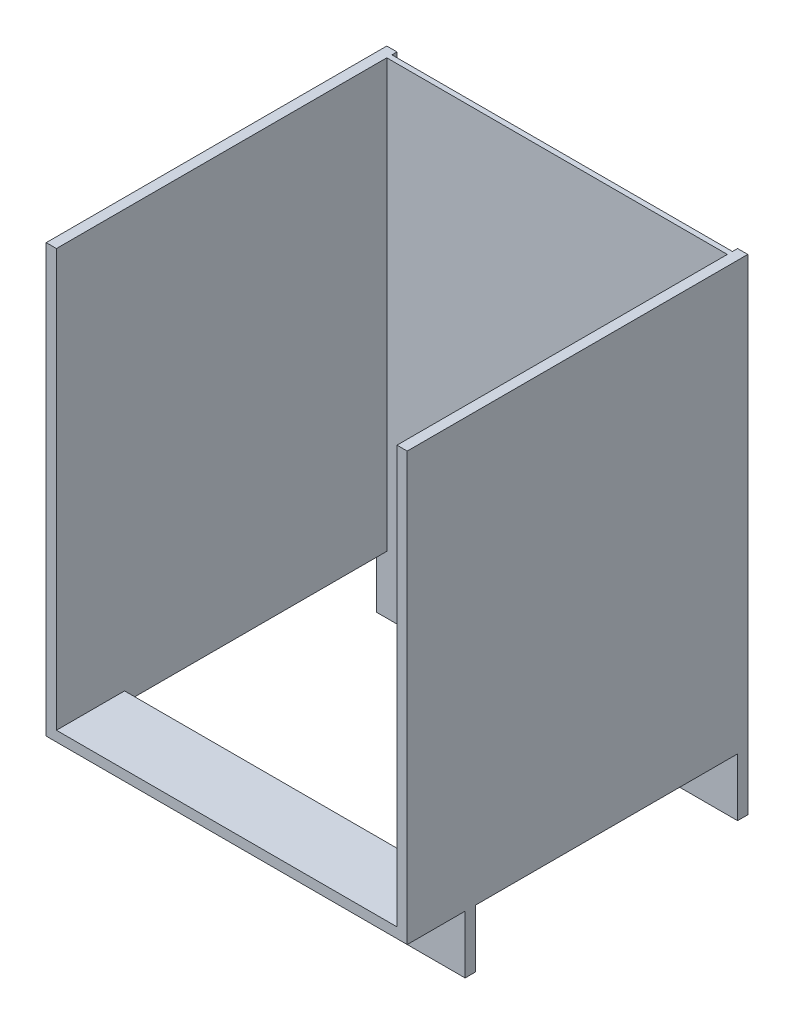
ISO-10303-21;
HEADER;
FILE_DESCRIPTION(('STEP AP214'),'2;1');
FILE_NAME('part.step','',(''),(''),'','','');
FILE_SCHEMA(('AUTOMOTIVE_DESIGN { 1 0 10303 214 1 1 1 1 }'));
ENDSEC;
DATA;
#1=APPLICATION_CONTEXT('core data for automotive mechanical design processes');
#2=APPLICATION_PROTOCOL_DEFINITION('international standard','automotive_design',2000,#1);
#3=PRODUCT_CONTEXT('',#1,'mechanical');
#4=PRODUCT('Part','Part','',(#3));
#5=PRODUCT_RELATED_PRODUCT_CATEGORY('part','',(#4));
#6=PRODUCT_DEFINITION_FORMATION('','',#4);
#7=PRODUCT_DEFINITION_CONTEXT('part definition',#1,'design');
#8=PRODUCT_DEFINITION('design','',#6,#7);
#9=PRODUCT_DEFINITION_SHAPE('','',#8);
#10=(LENGTH_UNIT() NAMED_UNIT(*) SI_UNIT(.MILLI.,.METRE.));
#11=(NAMED_UNIT(*) PLANE_ANGLE_UNIT() SI_UNIT($,.RADIAN.));
#12=(NAMED_UNIT(*) SI_UNIT($,.STERADIAN.) SOLID_ANGLE_UNIT());
#13=UNCERTAINTY_MEASURE_WITH_UNIT(LENGTH_MEASURE(1.E-05),#10,'distance_accuracy_value','');
#14=(GEOMETRIC_REPRESENTATION_CONTEXT(3) GLOBAL_UNCERTAINTY_ASSIGNED_CONTEXT((#13)) GLOBAL_UNIT_ASSIGNED_CONTEXT((#10,
#11,#12)) REPRESENTATION_CONTEXT('',''));
#15=CARTESIAN_POINT('',(0.,0.,0.));
#16=DIRECTION('',(0.,0.,1.));
#17=DIRECTION('',(1.,0.,0.));
#18=AXIS2_PLACEMENT_3D('',#15,#16,#17);
#19=CARTESIAN_POINT('',(0.,0.,600.));
#20=DIRECTION('',(0.,1.,0.));
#21=DIRECTION('',(0.,0.,1.));
#22=AXIS2_PLACEMENT_3D('',#19,#20,#21);
#23=PLANE('',#22);
#24=DIRECTION('',(1.,0.,0.));
#25=VECTOR('',#24,1.);
#26=CARTESIAN_POINT('',(636.,0.,18.));
#27=LINE('',#26,#25);
#28=CARTESIAN_POINT('',(0.,0.,18.));
#29=VERTEX_POINT('',#28);
#30=CARTESIAN_POINT('',(18.0000000000002,0.,18.));
#31=VERTEX_POINT('',#30);
#32=EDGE_CURVE('E207',#29,#31,#27,.T.);
#33=ORIENTED_EDGE('',*,*,#32,.T.);
#34=DIRECTION('',(0.,0.,-1.));
#35=VECTOR('',#34,1.);
#36=CARTESIAN_POINT('',(18.,0.,480.));
#37=LINE('',#36,#35);
#38=CARTESIAN_POINT('',(18.,0.,480.));
#39=VERTEX_POINT('',#38);
#40=EDGE_CURVE('E200',#39,#31,#37,.T.);
#41=ORIENTED_EDGE('',*,*,#40,.F.);
#42=DIRECTION('',(-1.,0.,0.));
#43=VECTOR('',#42,1.);
#44=CARTESIAN_POINT('',(0.,0.,480.));
#45=LINE('',#44,#43);
#46=CARTESIAN_POINT('',(0.,0.,480.));
#47=VERTEX_POINT('',#46);
#48=EDGE_CURVE('E234',#39,#47,#45,.T.);
#49=ORIENTED_EDGE('',*,*,#48,.T.);
#50=DIRECTION('',(0.,0.,-1.));
#51=VECTOR('',#50,1.);
#52=CARTESIAN_POINT('',(0.,0.,600.));
#53=LINE('',#52,#51);
#54=EDGE_CURVE('E51',#47,#29,#53,.T.);
#55=ORIENTED_EDGE('',*,*,#54,.T.);
#56=EDGE_LOOP('',(#33,#41,#49,#55));
#57=FACE_BOUND('',#56,.T.);
#58=ADVANCED_FACE('F43',(#57),#23,.F.);
#59=CARTESIAN_POINT('',(636.,0.,480.));
#60=VERTEX_POINT('',#59);
#61=CARTESIAN_POINT('',(618.,0.,480.));
#62=VERTEX_POINT('',#61);
#63=EDGE_CURVE('E198',#60,#62,#45,.T.);
#64=ORIENTED_EDGE('',*,*,#63,.T.);
#65=DIRECTION('',(0.,0.,1.));
#66=VECTOR('',#65,1.);
#67=CARTESIAN_POINT('',(618.,0.,480.));
#68=LINE('',#67,#66);
#69=CARTESIAN_POINT('',(618.,0.,18.));
#70=VERTEX_POINT('',#69);
#71=EDGE_CURVE('E184',#70,#62,#68,.T.);
#72=ORIENTED_EDGE('',*,*,#71,.F.);
#73=CARTESIAN_POINT('',(636.,0.,18.));
#74=VERTEX_POINT('',#73);
#75=EDGE_CURVE('E195',#70,#74,#27,.T.);
#76=ORIENTED_EDGE('',*,*,#75,.T.);
#77=DIRECTION('',(0.,0.,-1.));
#78=VECTOR('',#77,1.);
#79=CARTESIAN_POINT('',(636.,0.,600.));
#80=LINE('',#79,#78);
#81=EDGE_CURVE('E318',#60,#74,#80,.T.);
#82=ORIENTED_EDGE('',*,*,#81,.F.);
#83=EDGE_LOOP('',(#64,#72,#76,#82));
#84=FACE_BOUND('',#83,.T.);
#85=ADVANCED_FACE('F193',(#84),#23,.F.);
#86=DIRECTION('',(-1.,0.,0.));
#87=VECTOR('',#86,1.);
#88=CARTESIAN_POINT('',(0.,0.,498.));
#89=LINE('',#88,#87);
#90=CARTESIAN_POINT('',(636.,0.,498.));
#91=VERTEX_POINT('',#90);
#92=CARTESIAN_POINT('',(0.,0.,498.));
#93=VERTEX_POINT('',#92);
#94=EDGE_CURVE('E229',#91,#93,#89,.T.);
#95=ORIENTED_EDGE('',*,*,#94,.F.);
#96=CARTESIAN_POINT('',(636.,0.,600.));
#97=VERTEX_POINT('',#96);
#98=EDGE_CURVE('E319',#97,#91,#80,.T.);
#99=ORIENTED_EDGE('',*,*,#98,.F.);
#100=DIRECTION('',(1.,0.,0.));
#101=VECTOR('',#100,1.);
#102=CARTESIAN_POINT('',(0.,0.,600.));
#103=LINE('',#102,#101);
#104=CARTESIAN_POINT('',(0.,0.,600.));
#105=VERTEX_POINT('',#104);
#106=EDGE_CURVE('E298',#105,#97,#103,.T.);
#107=ORIENTED_EDGE('',*,*,#106,.F.);
#108=EDGE_CURVE('E11',#105,#93,#53,.T.);
#109=ORIENTED_EDGE('',*,*,#108,.T.);
#110=EDGE_LOOP('',(#95,#99,#107,#109));
#111=FACE_BOUND('',#110,.T.);
#112=ADVANCED_FACE('F363',(#111),#23,.F.);
#113=CARTESIAN_POINT('',(18.0000000000001,18.,-948.801876052108));
#114=DIRECTION('',(0.,-1.,0.));
#115=DIRECTION('',(0.,0.,-1.));
#116=AXIS2_PLACEMENT_3D('',#113,#114,#115);
#117=PLANE('',#116);
#118=DIRECTION('',(0.,0.,1.));
#119=VECTOR('',#118,1.);
#120=CARTESIAN_POINT('',(618.,18.,-948.801876052108));
#121=LINE('',#120,#119);
#122=CARTESIAN_POINT('',(618.,18.,480.));
#123=VERTEX_POINT('',#122);
#124=CARTESIAN_POINT('',(618.,18.,600.));
#125=VERTEX_POINT('',#124);
#126=EDGE_CURVE('E274',#123,#125,#121,.T.);
#127=ORIENTED_EDGE('',*,*,#126,.F.);
#128=DIRECTION('',(1.,0.,0.));
#129=VECTOR('',#128,1.);
#130=CARTESIAN_POINT('',(18.,18.,480.));
#131=LINE('',#130,#129);
#132=CARTESIAN_POINT('',(18.,18.,480.));
#133=VERTEX_POINT('',#132);
#134=EDGE_CURVE('E333',#133,#123,#131,.T.);
#135=ORIENTED_EDGE('',*,*,#134,.F.);
#136=DIRECTION('',(0.,0.,1.));
#137=VECTOR('',#136,1.);
#138=CARTESIAN_POINT('',(18.0000000000001,18.,-948.801876052108));
#139=LINE('',#138,#137);
#140=CARTESIAN_POINT('',(18.0000000000001,18.,600.));
#141=VERTEX_POINT('',#140);
#142=EDGE_CURVE('E278',#133,#141,#139,.T.);
#143=ORIENTED_EDGE('',*,*,#142,.T.);
#144=DIRECTION('',(1.,0.,0.));
#145=VECTOR('',#144,1.);
#146=CARTESIAN_POINT('',(18.0000000000001,18.,600.));
#147=LINE('',#146,#145);
#148=EDGE_CURVE('E267',#141,#125,#147,.T.);
#149=ORIENTED_EDGE('',*,*,#148,.T.);
#150=EDGE_LOOP('',(#127,#135,#143,#149));
#151=FACE_BOUND('',#150,.T.);
#152=ADVANCED_FACE('F379',(#151),#117,.F.);
#153=CARTESIAN_POINT('',(618.,753.,-948.801876052108));
#154=DIRECTION('',(1.,0.,0.));
#155=DIRECTION('',(0.,1.,0.));
#156=AXIS2_PLACEMENT_3D('',#153,#154,#155);
#157=PLANE('',#156);
#158=DIRECTION('',(0.,-1.,0.));
#159=VECTOR('',#158,1.);
#160=CARTESIAN_POINT('',(618.,753.,18.));
#161=LINE('',#160,#159);
#162=CARTESIAN_POINT('',(618.,753.,18.));
#163=VERTEX_POINT('',#162);
#164=EDGE_CURVE('E181',#163,#70,#161,.T.);
#165=ORIENTED_EDGE('',*,*,#164,.T.);
#166=ORIENTED_EDGE('',*,*,#71,.T.);
#167=DIRECTION('',(0.,-1.,0.));
#168=VECTOR('',#167,1.);
#169=CARTESIAN_POINT('',(618.,753.001,480.));
#170=LINE('',#169,#168);
#171=EDGE_CURVE('E199',#123,#62,#170,.T.);
#172=ORIENTED_EDGE('',*,*,#171,.F.);
#173=ORIENTED_EDGE('',*,*,#126,.T.);
#174=DIRECTION('',(0.,1.,0.));
#175=VECTOR('',#174,1.);
#176=CARTESIAN_POINT('',(618.,753.,600.));
#177=LINE('',#176,#175);
#178=CARTESIAN_POINT('',(618.,753.,600.));
#179=VERTEX_POINT('',#178);
#180=EDGE_CURVE('E264',#125,#179,#177,.T.);
#181=ORIENTED_EDGE('',*,*,#180,.T.);
#182=DIRECTION('',(0.,0.,1.));
#183=VECTOR('',#182,1.);
#184=CARTESIAN_POINT('',(618.,753.,-948.801876052108));
#185=LINE('',#184,#183);
#186=EDGE_CURVE('E187',#163,#179,#185,.T.);
#187=ORIENTED_EDGE('',*,*,#186,.F.);
#188=EDGE_LOOP('',(#165,#166,#172,#173,#181,#187));
#189=FACE_BOUND('',#188,.T.);
#190=ADVANCED_FACE('F183',(#189),#157,.F.);
#191=CARTESIAN_POINT('',(18.,753.,-948.801876052108));
#192=DIRECTION('',(-1.,0.,0.));
#193=DIRECTION('',(0.,-1.,0.));
#194=AXIS2_PLACEMENT_3D('',#191,#192,#193);
#195=PLANE('',#194);
#196=DIRECTION('',(0.,1.,0.));
#197=VECTOR('',#196,1.);
#198=CARTESIAN_POINT('',(18.0000000000001,753.,18.));
#199=LINE('',#198,#197);
#200=CARTESIAN_POINT('',(18.,753.,18.));
#201=VERTEX_POINT('',#200);
#202=EDGE_CURVE('E58',#31,#201,#199,.T.);
#203=ORIENTED_EDGE('',*,*,#202,.T.);
#204=DIRECTION('',(0.,0.,1.));
#205=VECTOR('',#204,1.);
#206=CARTESIAN_POINT('',(18.,753.,-948.801876052108));
#207=LINE('',#206,#205);
#208=CARTESIAN_POINT('',(18.,753.,600.));
#209=VERTEX_POINT('',#208);
#210=EDGE_CURVE('E285',#201,#209,#207,.T.);
#211=ORIENTED_EDGE('',*,*,#210,.T.);
#212=DIRECTION('',(0.,-1.,0.));
#213=VECTOR('',#212,1.);
#214=CARTESIAN_POINT('',(18.,753.,600.));
#215=LINE('',#214,#213);
#216=EDGE_CURVE('E260',#209,#141,#215,.T.);
#217=ORIENTED_EDGE('',*,*,#216,.T.);
#218=ORIENTED_EDGE('',*,*,#142,.F.);
#219=DIRECTION('',(0.,-1.,0.));
#220=VECTOR('',#219,1.);
#221=CARTESIAN_POINT('',(18.,753.001,480.));
#222=LINE('',#221,#220);
#223=EDGE_CURVE('E218',#133,#39,#222,.T.);
#224=ORIENTED_EDGE('',*,*,#223,.T.);
#225=ORIENTED_EDGE('',*,*,#40,.T.);
#226=EDGE_LOOP('',(#203,#211,#217,#218,#224,#225));
#227=FACE_BOUND('',#226,.T.);
#228=ADVANCED_FACE('F374',(#227),#195,.F.);
#229=CARTESIAN_POINT('',(0.,0.,600.));
#230=DIRECTION('',(1.,0.,0.));
#231=DIRECTION('',(0.,0.,-1.));
#232=AXIS2_PLACEMENT_3D('',#229,#230,#231);
#233=PLANE('',#232);
#234=DIRECTION('',(0.,-1.,0.));
#235=VECTOR('',#234,1.);
#236=CARTESIAN_POINT('',(0.,0.,0.));
#237=LINE('',#236,#235);
#238=CARTESIAN_POINT('',(0.,753.,0.));
#239=VERTEX_POINT('',#238);
#240=CARTESIAN_POINT('',(0.,-102.,0.));
#241=VERTEX_POINT('',#240);
#242=EDGE_CURVE('E294',#239,#241,#237,.T.);
#243=ORIENTED_EDGE('',*,*,#242,.T.);
#244=DIRECTION('',(0.,0.,-1.));
#245=VECTOR('',#244,1.);
#246=CARTESIAN_POINT('',(0.,-102.,18.));
#247=LINE('',#246,#245);
#248=CARTESIAN_POINT('',(0.,-102.,18.));
#249=VERTEX_POINT('',#248);
#250=EDGE_CURVE('E219',#249,#241,#247,.T.);
#251=ORIENTED_EDGE('',*,*,#250,.F.);
#252=DIRECTION('',(0.,1.,0.));
#253=VECTOR('',#252,1.);
#254=CARTESIAN_POINT('',(0.,0.,18.));
#255=LINE('',#254,#253);
#256=EDGE_CURVE('E208',#249,#29,#255,.T.);
#257=ORIENTED_EDGE('',*,*,#256,.T.);
#258=ORIENTED_EDGE('',*,*,#54,.F.);
#259=DIRECTION('',(0.,-1.,0.));
#260=VECTOR('',#259,1.);
#261=CARTESIAN_POINT('',(0.,0.,480.));
#262=LINE('',#261,#260);
#263=CARTESIAN_POINT('',(0.,-102.,480.));
#264=VERTEX_POINT('',#263);
#265=EDGE_CURVE('E225',#47,#264,#262,.T.);
#266=ORIENTED_EDGE('',*,*,#265,.T.);
#267=DIRECTION('',(0.,0.,1.));
#268=VECTOR('',#267,1.);
#269=CARTESIAN_POINT('',(0.,-102.,480.));
#270=LINE('',#269,#268);
#271=CARTESIAN_POINT('',(0.,-102.,498.));
#272=VERTEX_POINT('',#271);
#273=EDGE_CURVE('E236',#264,#272,#270,.T.);
#274=ORIENTED_EDGE('',*,*,#273,.T.);
#275=DIRECTION('',(0.,-1.,0.));
#276=VECTOR('',#275,1.);
#277=CARTESIAN_POINT('',(0.,0.,498.));
#278=LINE('',#277,#276);
#279=EDGE_CURVE('E222',#93,#272,#278,.T.);
#280=ORIENTED_EDGE('',*,*,#279,.F.);
#281=ORIENTED_EDGE('',*,*,#108,.F.);
#282=DIRECTION('',(0.,-1.,0.));
#283=VECTOR('',#282,1.);
#284=CARTESIAN_POINT('',(0.,0.,600.));
#285=LINE('',#284,#283);
#286=CARTESIAN_POINT('',(0.,753.,600.));
#287=VERTEX_POINT('',#286);
#288=EDGE_CURVE('E295',#287,#105,#285,.T.);
#289=ORIENTED_EDGE('',*,*,#288,.F.);
#290=DIRECTION('',(0.,0.,-1.));
#291=VECTOR('',#290,1.);
#292=CARTESIAN_POINT('',(0.,753.,600.));
#293=LINE('',#292,#291);
#294=EDGE_CURVE('E307',#287,#239,#293,.T.);
#295=ORIENTED_EDGE('',*,*,#294,.T.);
#296=EDGE_LOOP('',(#243,#251,#257,#258,#266,#274,#280,#281,#289,#295));
#297=FACE_BOUND('',#296,.T.);
#298=ADVANCED_FACE('F45',(#297),#233,.F.);
#299=CARTESIAN_POINT('',(636.,0.,600.));
#300=DIRECTION('',(-1.,0.,0.));
#301=DIRECTION('',(0.,0.,1.));
#302=AXIS2_PLACEMENT_3D('',#299,#300,#301);
#303=PLANE('',#302);
#304=DIRECTION('',(0.,1.,0.));
#305=VECTOR('',#304,1.);
#306=CARTESIAN_POINT('',(636.,0.,0.));
#307=LINE('',#306,#305);
#308=CARTESIAN_POINT('',(636.,-102.,0.));
#309=VERTEX_POINT('',#308);
#310=CARTESIAN_POINT('',(636.,753.,0.));
#311=VERTEX_POINT('',#310);
#312=EDGE_CURVE('E309',#309,#311,#307,.T.);
#313=ORIENTED_EDGE('',*,*,#312,.T.);
#314=DIRECTION('',(0.,0.,-1.));
#315=VECTOR('',#314,1.);
#316=CARTESIAN_POINT('',(636.,753.,600.));
#317=LINE('',#316,#315);
#318=CARTESIAN_POINT('',(636.,753.,600.));
#319=VERTEX_POINT('',#318);
#320=EDGE_CURVE('E316',#319,#311,#317,.T.);
#321=ORIENTED_EDGE('',*,*,#320,.F.);
#322=DIRECTION('',(0.,1.,0.));
#323=VECTOR('',#322,1.);
#324=CARTESIAN_POINT('',(636.,0.,600.));
#325=LINE('',#324,#323);
#326=EDGE_CURVE('E301',#97,#319,#325,.T.);
#327=ORIENTED_EDGE('',*,*,#326,.F.);
#328=ORIENTED_EDGE('',*,*,#98,.T.);
#329=DIRECTION('',(0.,1.,0.));
#330=VECTOR('',#329,1.);
#331=CARTESIAN_POINT('',(636.,0.,498.));
#332=LINE('',#331,#330);
#333=CARTESIAN_POINT('',(636.,-102.,498.));
#334=VERTEX_POINT('',#333);
#335=EDGE_CURVE('E242',#334,#91,#332,.T.);
#336=ORIENTED_EDGE('',*,*,#335,.F.);
#337=DIRECTION('',(0.,0.,1.));
#338=VECTOR('',#337,1.);
#339=CARTESIAN_POINT('',(636.,-102.,480.));
#340=LINE('',#339,#338);
#341=CARTESIAN_POINT('',(636.,-102.,480.));
#342=VERTEX_POINT('',#341);
#343=EDGE_CURVE('E190',#342,#334,#340,.T.);
#344=ORIENTED_EDGE('',*,*,#343,.F.);
#345=DIRECTION('',(0.,1.,0.));
#346=VECTOR('',#345,1.);
#347=CARTESIAN_POINT('',(636.,0.,480.));
#348=LINE('',#347,#346);
#349=EDGE_CURVE('E232',#342,#60,#348,.T.);
#350=ORIENTED_EDGE('',*,*,#349,.T.);
#351=ORIENTED_EDGE('',*,*,#81,.T.);
#352=DIRECTION('',(0.,-1.,0.));
#353=VECTOR('',#352,1.);
#354=CARTESIAN_POINT('',(636.,0.,18.));
#355=LINE('',#354,#353);
#356=CARTESIAN_POINT('',(636.,-102.,18.));
#357=VERTEX_POINT('',#356);
#358=EDGE_CURVE('E206',#74,#357,#355,.T.);
#359=ORIENTED_EDGE('',*,*,#358,.T.);
#360=DIRECTION('',(0.,0.,-1.));
#361=VECTOR('',#360,1.);
#362=CARTESIAN_POINT('',(636.,-102.,18.));
#363=LINE('',#362,#361);
#364=EDGE_CURVE('E210',#357,#309,#363,.T.);
#365=ORIENTED_EDGE('',*,*,#364,.T.);
#366=EDGE_LOOP('',(#313,#321,#327,#328,#336,#344,#350,#351,#359,#365));
#367=FACE_BOUND('',#366,.T.);
#368=ADVANCED_FACE('F325',(#367),#303,.F.);
#369=CARTESIAN_POINT('',(0.,753.,600.));
#370=DIRECTION('',(0.,-1.,0.));
#371=DIRECTION('',(0.,0.,-1.));
#372=AXIS2_PLACEMENT_3D('',#369,#370,#371);
#373=PLANE('',#372);
#374=DIRECTION('',(-1.,0.,0.));
#375=VECTOR('',#374,1.);
#376=CARTESIAN_POINT('',(0.,753.,600.));
#377=LINE('',#376,#375);
#378=EDGE_CURVE('E303',#209,#287,#377,.T.);
#379=ORIENTED_EDGE('',*,*,#378,.F.);
#380=ORIENTED_EDGE('',*,*,#210,.F.);
#381=DIRECTION('',(1.,0.,0.));
#382=VECTOR('',#381,1.);
#383=CARTESIAN_POINT('',(618.,753.,18.));
#384=LINE('',#383,#382);
#385=EDGE_CURVE('E252',#201,#163,#384,.T.);
#386=ORIENTED_EDGE('',*,*,#385,.T.);
#387=ORIENTED_EDGE('',*,*,#186,.T.);
#388=EDGE_CURVE('E304',#319,#179,#377,.T.);
#389=ORIENTED_EDGE('',*,*,#388,.F.);
#390=ORIENTED_EDGE('',*,*,#320,.T.);
#391=DIRECTION('',(-1.,0.,0.));
#392=VECTOR('',#391,1.);
#393=CARTESIAN_POINT('',(0.,753.,0.));
#394=LINE('',#393,#392);
#395=CARTESIAN_POINT('',(618.,753.,0.));
#396=VERTEX_POINT('',#395);
#397=EDGE_CURVE('E299',#311,#396,#394,.T.);
#398=ORIENTED_EDGE('',*,*,#397,.T.);
#399=CARTESIAN_POINT('',(618.,753.,9.00000000000001));
#400=VERTEX_POINT('',#399);
#401=EDGE_CURVE('E286',#396,#400,#185,.T.);
#402=ORIENTED_EDGE('',*,*,#401,.T.);
#403=DIRECTION('',(1.,0.,0.));
#404=VECTOR('',#403,1.);
#405=CARTESIAN_POINT('',(618.,753.,9.));
#406=LINE('',#405,#404);
#407=CARTESIAN_POINT('',(18.,753.,9.00000000000001));
#408=VERTEX_POINT('',#407);
#409=EDGE_CURVE('E258',#408,#400,#406,.T.);
#410=ORIENTED_EDGE('',*,*,#409,.F.);
#411=CARTESIAN_POINT('',(18.,753.,0.));
#412=VERTEX_POINT('',#411);
#413=EDGE_CURVE('E279',#412,#408,#207,.T.);
#414=ORIENTED_EDGE('',*,*,#413,.F.);
#415=EDGE_CURVE('E311',#412,#239,#394,.T.);
#416=ORIENTED_EDGE('',*,*,#415,.T.);
#417=ORIENTED_EDGE('',*,*,#294,.F.);
#418=EDGE_LOOP('',(#379,#380,#386,#387,#389,#390,#398,#402,#410,#414,#416,#417));
#419=FACE_BOUND('',#418,.T.);
#420=ADVANCED_FACE('F355',(#419),#373,.F.);
#421=CARTESIAN_POINT('',(0.,0.,600.));
#422=DIRECTION('',(0.,0.,-1.));
#423=DIRECTION('',(-1.,0.,0.));
#424=AXIS2_PLACEMENT_3D('',#421,#422,#423);
#425=PLANE('',#424);
#426=ORIENTED_EDGE('',*,*,#388,.T.);
#427=ORIENTED_EDGE('',*,*,#180,.F.);
#428=ORIENTED_EDGE('',*,*,#148,.F.);
#429=ORIENTED_EDGE('',*,*,#216,.F.);
#430=ORIENTED_EDGE('',*,*,#378,.T.);
#431=ORIENTED_EDGE('',*,*,#288,.T.);
#432=ORIENTED_EDGE('',*,*,#106,.T.);
#433=ORIENTED_EDGE('',*,*,#326,.T.);
#434=EDGE_LOOP('',(#426,#427,#428,#429,#430,#431,#432,#433));
#435=FACE_BOUND('',#434,.T.);
#436=ADVANCED_FACE('F358',(#435),#425,.F.);
#437=CARTESIAN_POINT('',(0.,0.,0.));
#438=DIRECTION('',(0.,0.,-1.));
#439=DIRECTION('',(-1.,0.,0.));
#440=AXIS2_PLACEMENT_3D('',#437,#438,#439);
#441=PLANE('',#440);
#442=DIRECTION('',(0.,1.,0.));
#443=VECTOR('',#442,1.);
#444=CARTESIAN_POINT('',(618.,753.,0.));
#445=LINE('',#444,#443);
#446=CARTESIAN_POINT('',(618.,18.,0.));
#447=VERTEX_POINT('',#446);
#448=EDGE_CURVE('E280',#447,#396,#445,.T.);
#449=ORIENTED_EDGE('',*,*,#448,.T.);
#450=ORIENTED_EDGE('',*,*,#397,.F.);
#451=ORIENTED_EDGE('',*,*,#312,.F.);
#452=DIRECTION('',(-1.,0.,0.));
#453=VECTOR('',#452,1.);
#454=CARTESIAN_POINT('',(636.,-102.,0.));
#455=LINE('',#454,#453);
#456=EDGE_CURVE('E215',#309,#241,#455,.T.);
#457=ORIENTED_EDGE('',*,*,#456,.T.);
#458=ORIENTED_EDGE('',*,*,#242,.F.);
#459=ORIENTED_EDGE('',*,*,#415,.F.);
#460=DIRECTION('',(0.,-1.,0.));
#461=VECTOR('',#460,1.);
#462=CARTESIAN_POINT('',(18.,753.,0.));
#463=LINE('',#462,#461);
#464=CARTESIAN_POINT('',(18.0000000000001,18.,0.));
#465=VERTEX_POINT('',#464);
#466=EDGE_CURVE('E275',#412,#465,#463,.T.);
#467=ORIENTED_EDGE('',*,*,#466,.T.);
#468=DIRECTION('',(1.,0.,0.));
#469=VECTOR('',#468,1.);
#470=CARTESIAN_POINT('',(18.0000000000001,18.,0.));
#471=LINE('',#470,#469);
#472=EDGE_CURVE('E266',#465,#447,#471,.T.);
#473=ORIENTED_EDGE('',*,*,#472,.T.);
#474=EDGE_LOOP('',(#449,#450,#451,#457,#458,#459,#467,#473));
#475=FACE_BOUND('',#474,.T.);
#476=ADVANCED_FACE('F349',(#475),#441,.T.);
#477=CARTESIAN_POINT('',(18.0000000000001,18.,9.00000000000001));
#478=VERTEX_POINT('',#477);
#479=EDGE_CURVE('E291',#465,#478,#139,.T.);
#480=ORIENTED_EDGE('',*,*,#479,.T.);
#481=DIRECTION('',(-1.,0.,0.));
#482=VECTOR('',#481,1.);
#483=CARTESIAN_POINT('',(618.,18.,9.));
#484=LINE('',#483,#482);
#485=CARTESIAN_POINT('',(618.,18.,9.00000000000001));
#486=VERTEX_POINT('',#485);
#487=EDGE_CURVE('E251',#486,#478,#484,.T.);
#488=ORIENTED_EDGE('',*,*,#487,.F.);
#489=EDGE_CURVE('E283',#447,#486,#121,.T.);
#490=ORIENTED_EDGE('',*,*,#489,.F.);
#491=ORIENTED_EDGE('',*,*,#472,.F.);
#492=EDGE_LOOP('',(#480,#488,#490,#491));
#493=FACE_BOUND('',#492,.T.);
#494=ADVANCED_FACE('F388',(#493),#117,.F.);
#495=ORIENTED_EDGE('',*,*,#489,.T.);
#496=DIRECTION('',(0.,-1.,0.));
#497=VECTOR('',#496,1.);
#498=CARTESIAN_POINT('',(618.,753.,9.));
#499=LINE('',#498,#497);
#500=EDGE_CURVE('E248',#400,#486,#499,.T.);
#501=ORIENTED_EDGE('',*,*,#500,.F.);
#502=ORIENTED_EDGE('',*,*,#401,.F.);
#503=ORIENTED_EDGE('',*,*,#448,.F.);
#504=EDGE_LOOP('',(#495,#501,#502,#503));
#505=FACE_BOUND('',#504,.T.);
#506=ADVANCED_FACE('F391',(#505),#157,.F.);
#507=ORIENTED_EDGE('',*,*,#413,.T.);
#508=DIRECTION('',(0.,1.,0.));
#509=VECTOR('',#508,1.);
#510=CARTESIAN_POINT('',(18.0000000000001,753.,9.));
#511=LINE('',#510,#509);
#512=EDGE_CURVE('E255',#478,#408,#511,.T.);
#513=ORIENTED_EDGE('',*,*,#512,.F.);
#514=ORIENTED_EDGE('',*,*,#479,.F.);
#515=ORIENTED_EDGE('',*,*,#466,.F.);
#516=EDGE_LOOP('',(#507,#513,#514,#515));
#517=FACE_BOUND('',#516,.T.);
#518=ADVANCED_FACE('F383',(#517),#195,.F.);
#519=CARTESIAN_POINT('',(0.,0.,9.));
#520=DIRECTION('',(0.,0.,-1.));
#521=DIRECTION('',(-1.,0.,0.));
#522=AXIS2_PLACEMENT_3D('',#519,#520,#521);
#523=PLANE('',#522);
#524=ORIENTED_EDGE('',*,*,#500,.T.);
#525=ORIENTED_EDGE('',*,*,#487,.T.);
#526=ORIENTED_EDGE('',*,*,#512,.T.);
#527=ORIENTED_EDGE('',*,*,#409,.T.);
#528=EDGE_LOOP('',(#524,#525,#526,#527));
#529=FACE_BOUND('',#528,.T.);
#530=ADVANCED_FACE('F385',(#529),#523,.T.);
#531=CARTESIAN_POINT('',(0.,0.,18.));
#532=DIRECTION('',(0.,0.,-1.));
#533=DIRECTION('',(-1.,0.,0.));
#534=AXIS2_PLACEMENT_3D('',#531,#532,#533);
#535=PLANE('',#534);
#536=ORIENTED_EDGE('',*,*,#164,.F.);
#537=ORIENTED_EDGE('',*,*,#385,.F.);
#538=ORIENTED_EDGE('',*,*,#202,.F.);
#539=ORIENTED_EDGE('',*,*,#32,.F.);
#540=ORIENTED_EDGE('',*,*,#256,.F.);
#541=DIRECTION('',(-1.,0.,0.));
#542=VECTOR('',#541,1.);
#543=CARTESIAN_POINT('',(636.,-102.,18.));
#544=LINE('',#543,#542);
#545=EDGE_CURVE('E211',#357,#249,#544,.T.);
#546=ORIENTED_EDGE('',*,*,#545,.F.);
#547=ORIENTED_EDGE('',*,*,#358,.F.);
#548=ORIENTED_EDGE('',*,*,#75,.F.);
#549=EDGE_LOOP('',(#536,#537,#538,#539,#540,#546,#547,#548));
#550=FACE_BOUND('',#549,.T.);
#551=ADVANCED_FACE('F203',(#550),#535,.F.);
#552=CARTESIAN_POINT('',(0.,-102.,480.));
#553=DIRECTION('',(0.,-1.,0.));
#554=DIRECTION('',(0.,0.,-1.));
#555=AXIS2_PLACEMENT_3D('',#552,#553,#554);
#556=PLANE('',#555);
#557=DIRECTION('',(1.,0.,0.));
#558=VECTOR('',#557,1.);
#559=CARTESIAN_POINT('',(0.,-102.,498.));
#560=LINE('',#559,#558);
#561=EDGE_CURVE('E239',#272,#334,#560,.T.);
#562=ORIENTED_EDGE('',*,*,#561,.F.);
#563=ORIENTED_EDGE('',*,*,#273,.F.);
#564=DIRECTION('',(1.,0.,0.));
#565=VECTOR('',#564,1.);
#566=CARTESIAN_POINT('',(0.,-102.,480.));
#567=LINE('',#566,#565);
#568=EDGE_CURVE('E228',#264,#342,#567,.T.);
#569=ORIENTED_EDGE('',*,*,#568,.T.);
#570=ORIENTED_EDGE('',*,*,#343,.T.);
#571=EDGE_LOOP('',(#562,#563,#569,#570));
#572=FACE_BOUND('',#571,.T.);
#573=ADVANCED_FACE('F368',(#572),#556,.T.);
#574=CARTESIAN_POINT('',(0.,0.,480.));
#575=DIRECTION('',(0.,0.,1.));
#576=DIRECTION('',(1.,0.,0.));
#577=AXIS2_PLACEMENT_3D('',#574,#575,#576);
#578=PLANE('',#577);
#579=ORIENTED_EDGE('',*,*,#265,.F.);
#580=ORIENTED_EDGE('',*,*,#48,.F.);
#581=ORIENTED_EDGE('',*,*,#223,.F.);
#582=ORIENTED_EDGE('',*,*,#134,.T.);
#583=ORIENTED_EDGE('',*,*,#171,.T.);
#584=ORIENTED_EDGE('',*,*,#63,.F.);
#585=ORIENTED_EDGE('',*,*,#349,.F.);
#586=ORIENTED_EDGE('',*,*,#568,.F.);
#587=EDGE_LOOP('',(#579,#580,#581,#582,#583,#584,#585,#586));
#588=FACE_BOUND('',#587,.T.);
#589=ADVANCED_FACE('F330',(#588),#578,.F.);
#590=CARTESIAN_POINT('',(0.,0.,498.));
#591=DIRECTION('',(0.,0.,1.));
#592=DIRECTION('',(1.,0.,0.));
#593=AXIS2_PLACEMENT_3D('',#590,#591,#592);
#594=PLANE('',#593);
#595=ORIENTED_EDGE('',*,*,#279,.T.);
#596=ORIENTED_EDGE('',*,*,#561,.T.);
#597=ORIENTED_EDGE('',*,*,#335,.T.);
#598=ORIENTED_EDGE('',*,*,#94,.T.);
#599=EDGE_LOOP('',(#595,#596,#597,#598));
#600=FACE_BOUND('',#599,.T.);
#601=ADVANCED_FACE('F365',(#600),#594,.T.);
#602=CARTESIAN_POINT('',(636.,-102.,18.));
#603=DIRECTION('',(0.,-1.,0.));
#604=DIRECTION('',(0.,0.,-1.));
#605=AXIS2_PLACEMENT_3D('',#602,#603,#604);
#606=PLANE('',#605);
#607=ORIENTED_EDGE('',*,*,#456,.F.);
#608=ORIENTED_EDGE('',*,*,#364,.F.);
#609=ORIENTED_EDGE('',*,*,#545,.T.);
#610=ORIENTED_EDGE('',*,*,#250,.T.);
#611=EDGE_LOOP('',(#607,#608,#609,#610));
#612=FACE_BOUND('',#611,.T.);
#613=ADVANCED_FACE('F341',(#612),#606,.T.);
#614=CLOSED_SHELL('',(#58,#85,#112,#152,#190,#228,#298,#368,#420,#436,#476,#494,#506,#518,#530,
#551,#573,#589,#601,#613));
#615=MANIFOLD_SOLID_BREP('B2',#614);
#616=ADVANCED_BREP_SHAPE_REPRESENTATION('',(#18,#615),#14);
#617=SHAPE_DEFINITION_REPRESENTATION(#9,#616);
ENDSEC;
END-ISO-10303-21;
